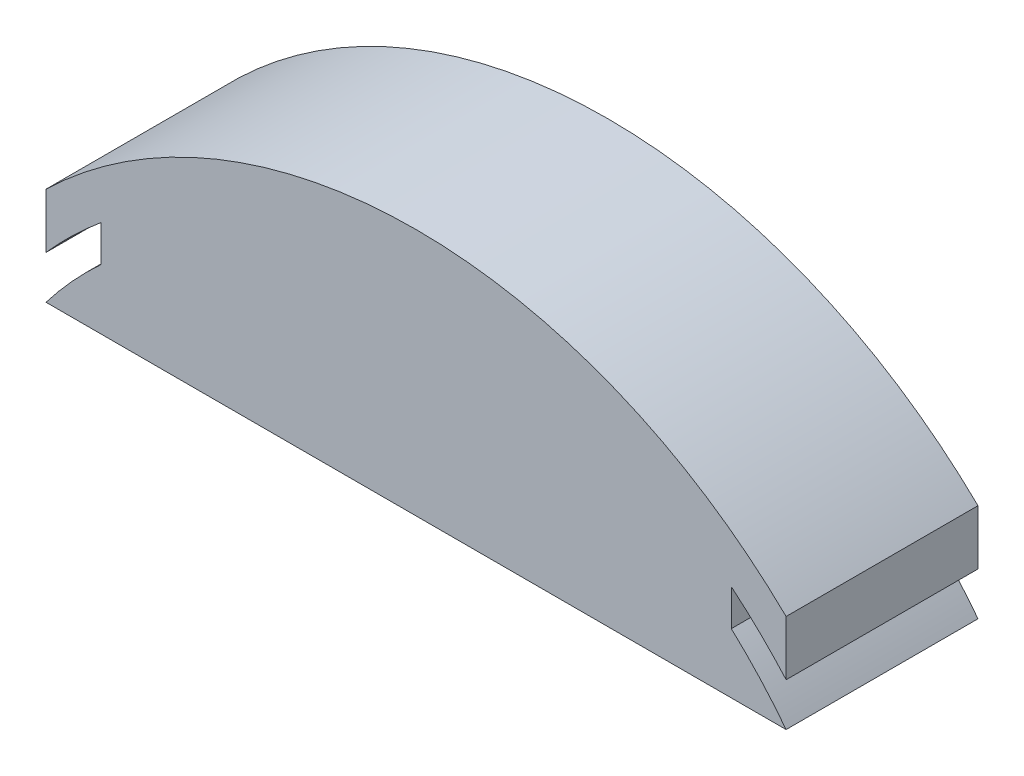
ISO-10303-21;
HEADER;
FILE_DESCRIPTION(('STEP AP214'),'2;1');
FILE_NAME('part.step','',(''),(''),'','','');
FILE_SCHEMA(('AUTOMOTIVE_DESIGN { 1 0 10303 214 1 1 1 1 }'));
ENDSEC;
DATA;
#1=APPLICATION_CONTEXT('core data for automotive mechanical design processes');
#2=APPLICATION_PROTOCOL_DEFINITION('international standard','automotive_design',2000,#1);
#3=PRODUCT_CONTEXT('',#1,'mechanical');
#4=PRODUCT('Part','Part','',(#3));
#5=PRODUCT_RELATED_PRODUCT_CATEGORY('part','',(#4));
#6=PRODUCT_DEFINITION_FORMATION('','',#4);
#7=PRODUCT_DEFINITION_CONTEXT('part definition',#1,'design');
#8=PRODUCT_DEFINITION('design','',#6,#7);
#9=PRODUCT_DEFINITION_SHAPE('','',#8);
#10=(LENGTH_UNIT() NAMED_UNIT(*) SI_UNIT(.MILLI.,.METRE.));
#11=(NAMED_UNIT(*) PLANE_ANGLE_UNIT() SI_UNIT($,.RADIAN.));
#12=(NAMED_UNIT(*) SI_UNIT($,.STERADIAN.) SOLID_ANGLE_UNIT());
#13=UNCERTAINTY_MEASURE_WITH_UNIT(LENGTH_MEASURE(1.E-05),#10,'distance_accuracy_value','');
#14=(GEOMETRIC_REPRESENTATION_CONTEXT(3) GLOBAL_UNCERTAINTY_ASSIGNED_CONTEXT((#13)) GLOBAL_UNIT_ASSIGNED_CONTEXT((#10,
#11,#12)) REPRESENTATION_CONTEXT('',''));
#15=CARTESIAN_POINT('',(0.,0.,0.));
#16=DIRECTION('',(0.,0.,1.));
#17=DIRECTION('',(1.,0.,0.));
#18=AXIS2_PLACEMENT_3D('',#15,#16,#17);
#19=CARTESIAN_POINT('',(0.,1.57389173990474,7.));
#20=DIRECTION('',(-1.,0.,0.));
#21=DIRECTION('',(0.,0.,1.));
#22=AXIS2_PLACEMENT_3D('',#19,#20,#21);
#23=PLANE('',#22);
#24=DIRECTION('',(0.,1.,0.));
#25=VECTOR('',#24,1.);
#26=CARTESIAN_POINT('',(0.,1.57389173990474,0.));
#27=LINE('',#26,#25);
#28=CARTESIAN_POINT('',(0.,1.57389173990474,0.));
#29=VERTEX_POINT('',#28);
#30=CARTESIAN_POINT('',(0.,3.57389173990474,0.));
#31=VERTEX_POINT('',#30);
#32=EDGE_CURVE('E147',#29,#31,#27,.T.);
#33=ORIENTED_EDGE('',*,*,#32,.F.);
#34=DIRECTION('',(0.,0.,-1.));
#35=VECTOR('',#34,1.);
#36=CARTESIAN_POINT('',(0.,1.57389173990474,7.));
#37=LINE('',#36,#35);
#38=CARTESIAN_POINT('',(0.,1.57389173990474,7.));
#39=VERTEX_POINT('',#38);
#40=EDGE_CURVE('E11',#39,#29,#37,.T.);
#41=ORIENTED_EDGE('',*,*,#40,.F.);
#42=DIRECTION('',(0.,1.,0.));
#43=VECTOR('',#42,1.);
#44=CARTESIAN_POINT('',(0.,1.57389173990474,7.));
#45=LINE('',#44,#43);
#46=CARTESIAN_POINT('',(0.,3.57389173990474,7.));
#47=VERTEX_POINT('',#46);
#48=EDGE_CURVE('E170',#39,#47,#45,.T.);
#49=ORIENTED_EDGE('',*,*,#48,.T.);
#50=DIRECTION('',(0.,0.,-1.));
#51=VECTOR('',#50,1.);
#52=CARTESIAN_POINT('',(0.,3.57389173990474,7.));
#53=LINE('',#52,#51);
#54=EDGE_CURVE('E41',#47,#31,#53,.T.);
#55=ORIENTED_EDGE('',*,*,#54,.T.);
#56=EDGE_LOOP('',(#33,#41,#49,#55));
#57=FACE_BOUND('',#56,.T.);
#58=ADVANCED_FACE('F38',(#57),#23,.T.);
#59=CARTESIAN_POINT('',(13.5,-10.3319891598859,7.));
#60=DIRECTION('',(0.,0.,-1.));
#61=DIRECTION('',(-1.,0.,0.));
#62=AXIS2_PLACEMENT_3D('',#59,#60,#61);
#63=CYLINDRICAL_SURFACE('',#62,18.);
#64=CARTESIAN_POINT('',(13.5,-10.3319891598859,0.));
#65=DIRECTION('',(0.,0.,-1.));
#66=DIRECTION('',(-1.,0.,0.));
#67=AXIS2_PLACEMENT_3D('',#64,#65,#66);
#68=CIRCLE('',#67,18.);
#69=CARTESIAN_POINT('',(2.,3.51539326424031,0.));
#70=VERTEX_POINT('',#69);
#71=EDGE_CURVE('E169',#29,#70,#68,.T.);
#72=ORIENTED_EDGE('',*,*,#71,.T.);
#73=DIRECTION('',(0.,0.,-1.));
#74=VECTOR('',#73,1.);
#75=CARTESIAN_POINT('',(2.,3.51539326424031,7.));
#76=LINE('',#75,#74);
#77=CARTESIAN_POINT('',(2.,3.51539326424031,7.));
#78=VERTEX_POINT('',#77);
#79=EDGE_CURVE('E47',#78,#70,#76,.T.);
#80=ORIENTED_EDGE('',*,*,#79,.F.);
#81=CARTESIAN_POINT('',(13.5,-10.3319891598859,7.));
#82=DIRECTION('',(0.,0.,-1.));
#83=DIRECTION('',(-1.,0.,0.));
#84=AXIS2_PLACEMENT_3D('',#81,#82,#83);
#85=CIRCLE('',#84,18.);
#86=EDGE_CURVE('E136',#39,#78,#85,.T.);
#87=ORIENTED_EDGE('',*,*,#86,.F.);
#88=ORIENTED_EDGE('',*,*,#40,.T.);
#89=EDGE_LOOP('',(#72,#80,#87,#88));
#90=FACE_BOUND('',#89,.T.);
#91=ADVANCED_FACE('F189',(#90),#63,.F.);
#92=CARTESIAN_POINT('',(2.,2.187994865663,7.));
#93=DIRECTION('',(-1.,0.,0.));
#94=DIRECTION('',(0.,-1.,0.));
#95=AXIS2_PLACEMENT_3D('',#92,#93,#94);
#96=PLANE('',#95);
#97=DIRECTION('',(0.,1.,0.));
#98=VECTOR('',#97,1.);
#99=CARTESIAN_POINT('',(2.,2.187994865663,0.));
#100=LINE('',#99,#98);
#101=CARTESIAN_POINT('',(2.,2.187994865663,0.));
#102=VERTEX_POINT('',#101);
#103=EDGE_CURVE('E124',#102,#70,#100,.T.);
#104=ORIENTED_EDGE('',*,*,#103,.F.);
#105=DIRECTION('',(0.,0.,-1.));
#106=VECTOR('',#105,1.);
#107=CARTESIAN_POINT('',(2.,2.187994865663,7.));
#108=LINE('',#107,#106);
#109=CARTESIAN_POINT('',(2.,2.187994865663,7.));
#110=VERTEX_POINT('',#109);
#111=EDGE_CURVE('E119',#110,#102,#108,.T.);
#112=ORIENTED_EDGE('',*,*,#111,.F.);
#113=DIRECTION('',(0.,1.,0.));
#114=VECTOR('',#113,1.);
#115=CARTESIAN_POINT('',(2.,2.187994865663,7.));
#116=LINE('',#115,#114);
#117=EDGE_CURVE('E122',#110,#78,#116,.T.);
#118=ORIENTED_EDGE('',*,*,#117,.T.);
#119=ORIENTED_EDGE('',*,*,#79,.T.);
#120=EDGE_LOOP('',(#104,#112,#118,#119));
#121=FACE_BOUND('',#120,.T.);
#122=ADVANCED_FACE('F121',(#121),#96,.T.);
#123=CARTESIAN_POINT('',(13.5,-10.3319891598859,7.));
#124=DIRECTION('',(0.,0.,-1.));
#125=DIRECTION('',(-1.,0.,0.));
#126=AXIS2_PLACEMENT_3D('',#123,#124,#125);
#127=CYLINDRICAL_SURFACE('',#126,17.);
#128=CARTESIAN_POINT('',(13.5,-10.3319891598859,0.));
#129=DIRECTION('',(0.,0.,-1.));
#130=DIRECTION('',(-1.,0.,0.));
#131=AXIS2_PLACEMENT_3D('',#128,#129,#130);
#132=CIRCLE('',#131,17.);
#133=CARTESIAN_POINT('',(0.,0.,0.));
#134=VERTEX_POINT('',#133);
#135=EDGE_CURVE('E166',#134,#102,#132,.T.);
#136=ORIENTED_EDGE('',*,*,#135,.F.);
#137=DIRECTION('',(0.,0.,-1.));
#138=VECTOR('',#137,1.);
#139=CARTESIAN_POINT('',(0.,0.,7.));
#140=LINE('',#139,#138);
#141=CARTESIAN_POINT('',(0.,0.,7.));
#142=VERTEX_POINT('',#141);
#143=EDGE_CURVE('E129',#142,#134,#140,.T.);
#144=ORIENTED_EDGE('',*,*,#143,.F.);
#145=CARTESIAN_POINT('',(13.5,-10.3319891598859,7.));
#146=DIRECTION('',(0.,0.,-1.));
#147=DIRECTION('',(-1.,0.,0.));
#148=AXIS2_PLACEMENT_3D('',#145,#146,#147);
#149=CIRCLE('',#148,17.);
#150=EDGE_CURVE('E135',#142,#110,#149,.T.);
#151=ORIENTED_EDGE('',*,*,#150,.T.);
#152=ORIENTED_EDGE('',*,*,#111,.T.);
#153=EDGE_LOOP('',(#136,#144,#151,#152));
#154=FACE_BOUND('',#153,.T.);
#155=ADVANCED_FACE('F138',(#154),#127,.T.);
#156=CARTESIAN_POINT('',(0.,0.,7.));
#157=DIRECTION('',(0.,1.,0.));
#158=DIRECTION('',(0.,0.,1.));
#159=AXIS2_PLACEMENT_3D('',#156,#157,#158);
#160=PLANE('',#159);
#161=DIRECTION('',(1.,0.,0.));
#162=VECTOR('',#161,1.);
#163=CARTESIAN_POINT('',(0.,0.,0.));
#164=LINE('',#163,#162);
#165=CARTESIAN_POINT('',(27.,0.,0.));
#166=VERTEX_POINT('',#165);
#167=EDGE_CURVE('E163',#134,#166,#164,.T.);
#168=ORIENTED_EDGE('',*,*,#167,.T.);
#169=DIRECTION('',(0.,0.,-1.));
#170=VECTOR('',#169,1.);
#171=CARTESIAN_POINT('',(27.,0.,7.));
#172=LINE('',#171,#170);
#173=CARTESIAN_POINT('',(27.,0.,7.));
#174=VERTEX_POINT('',#173);
#175=EDGE_CURVE('E174',#174,#166,#172,.T.);
#176=ORIENTED_EDGE('',*,*,#175,.F.);
#177=DIRECTION('',(1.,0.,0.));
#178=VECTOR('',#177,1.);
#179=CARTESIAN_POINT('',(0.,0.,7.));
#180=LINE('',#179,#178);
#181=EDGE_CURVE('E140',#142,#174,#180,.T.);
#182=ORIENTED_EDGE('',*,*,#181,.F.);
#183=ORIENTED_EDGE('',*,*,#143,.T.);
#184=EDGE_LOOP('',(#168,#176,#182,#183));
#185=FACE_BOUND('',#184,.T.);
#186=ADVANCED_FACE('F208',(#185),#160,.F.);
#187=CARTESIAN_POINT('',(13.5,-10.3319891598859,7.));
#188=DIRECTION('',(0.,0.,-1.));
#189=DIRECTION('',(-1.,0.,0.));
#190=AXIS2_PLACEMENT_3D('',#187,#188,#189);
#191=CYLINDRICAL_SURFACE('',#190,17.);
#192=CARTESIAN_POINT('',(13.5,-10.3319891598859,0.));
#193=DIRECTION('',(0.,0.,-1.));
#194=DIRECTION('',(-1.,0.,0.));
#195=AXIS2_PLACEMENT_3D('',#192,#193,#194);
#196=CIRCLE('',#195,17.);
#197=CARTESIAN_POINT('',(25.,2.187994865663,0.));
#198=VERTEX_POINT('',#197);
#199=EDGE_CURVE('E160',#198,#166,#196,.T.);
#200=ORIENTED_EDGE('',*,*,#199,.F.);
#201=DIRECTION('',(0.,0.,-1.));
#202=VECTOR('',#201,1.);
#203=CARTESIAN_POINT('',(25.,2.187994865663,7.));
#204=LINE('',#203,#202);
#205=CARTESIAN_POINT('',(25.,2.187994865663,7.));
#206=VERTEX_POINT('',#205);
#207=EDGE_CURVE('E176',#206,#198,#204,.T.);
#208=ORIENTED_EDGE('',*,*,#207,.F.);
#209=CARTESIAN_POINT('',(13.5,-10.3319891598859,7.));
#210=DIRECTION('',(0.,0.,-1.));
#211=DIRECTION('',(-1.,0.,0.));
#212=AXIS2_PLACEMENT_3D('',#209,#210,#211);
#213=CIRCLE('',#212,17.);
#214=EDGE_CURVE('E142',#206,#174,#213,.T.);
#215=ORIENTED_EDGE('',*,*,#214,.T.);
#216=ORIENTED_EDGE('',*,*,#175,.T.);
#217=EDGE_LOOP('',(#200,#208,#215,#216));
#218=FACE_BOUND('',#217,.T.);
#219=ADVANCED_FACE('F203',(#218),#191,.T.);
#220=CARTESIAN_POINT('',(25.,2.187994865663,7.));
#221=DIRECTION('',(-1.,0.,0.));
#222=DIRECTION('',(0.,0.,1.));
#223=AXIS2_PLACEMENT_3D('',#220,#221,#222);
#224=PLANE('',#223);
#225=DIRECTION('',(0.,1.,0.));
#226=VECTOR('',#225,1.);
#227=CARTESIAN_POINT('',(25.,2.187994865663,0.));
#228=LINE('',#227,#226);
#229=CARTESIAN_POINT('',(25.,3.51539326424031,0.));
#230=VERTEX_POINT('',#229);
#231=EDGE_CURVE('E158',#198,#230,#228,.T.);
#232=ORIENTED_EDGE('',*,*,#231,.T.);
#233=DIRECTION('',(0.,0.,-1.));
#234=VECTOR('',#233,1.);
#235=CARTESIAN_POINT('',(25.,3.51539326424031,7.));
#236=LINE('',#235,#234);
#237=CARTESIAN_POINT('',(25.,3.51539326424031,7.));
#238=VERTEX_POINT('',#237);
#239=EDGE_CURVE('E178',#238,#230,#236,.T.);
#240=ORIENTED_EDGE('',*,*,#239,.F.);
#241=DIRECTION('',(0.,1.,0.));
#242=VECTOR('',#241,1.);
#243=CARTESIAN_POINT('',(25.,2.187994865663,7.));
#244=LINE('',#243,#242);
#245=EDGE_CURVE('E198',#206,#238,#244,.T.);
#246=ORIENTED_EDGE('',*,*,#245,.F.);
#247=ORIENTED_EDGE('',*,*,#207,.T.);
#248=EDGE_LOOP('',(#232,#240,#246,#247));
#249=FACE_BOUND('',#248,.T.);
#250=ADVANCED_FACE('F213',(#249),#224,.F.);
#251=CARTESIAN_POINT('',(13.5,-10.3319891598859,7.));
#252=DIRECTION('',(0.,0.,-1.));
#253=DIRECTION('',(-1.,0.,0.));
#254=AXIS2_PLACEMENT_3D('',#251,#252,#253);
#255=CYLINDRICAL_SURFACE('',#254,18.);
#256=CARTESIAN_POINT('',(13.5,-10.3319891598859,0.));
#257=DIRECTION('',(0.,0.,-1.));
#258=DIRECTION('',(-1.,0.,0.));
#259=AXIS2_PLACEMENT_3D('',#256,#257,#258);
#260=CIRCLE('',#259,18.);
#261=CARTESIAN_POINT('',(27.,1.57389173990474,0.));
#262=VERTEX_POINT('',#261);
#263=EDGE_CURVE('E156',#230,#262,#260,.T.);
#264=ORIENTED_EDGE('',*,*,#263,.T.);
#265=DIRECTION('',(0.,0.,-1.));
#266=VECTOR('',#265,1.);
#267=CARTESIAN_POINT('',(27.,1.57389173990474,7.));
#268=LINE('',#267,#266);
#269=CARTESIAN_POINT('',(27.,1.57389173990474,7.));
#270=VERTEX_POINT('',#269);
#271=EDGE_CURVE('E181',#270,#262,#268,.T.);
#272=ORIENTED_EDGE('',*,*,#271,.F.);
#273=CARTESIAN_POINT('',(13.5,-10.3319891598859,7.));
#274=DIRECTION('',(0.,0.,-1.));
#275=DIRECTION('',(-1.,0.,0.));
#276=AXIS2_PLACEMENT_3D('',#273,#274,#275);
#277=CIRCLE('',#276,18.);
#278=EDGE_CURVE('E196',#238,#270,#277,.T.);
#279=ORIENTED_EDGE('',*,*,#278,.F.);
#280=ORIENTED_EDGE('',*,*,#239,.T.);
#281=EDGE_LOOP('',(#264,#272,#279,#280));
#282=FACE_BOUND('',#281,.T.);
#283=ADVANCED_FACE('F216',(#282),#255,.F.);
#284=CARTESIAN_POINT('',(27.,1.57389173990474,7.));
#285=DIRECTION('',(-1.,0.,0.));
#286=DIRECTION('',(0.,0.,1.));
#287=AXIS2_PLACEMENT_3D('',#284,#285,#286);
#288=PLANE('',#287);
#289=DIRECTION('',(0.,1.,0.));
#290=VECTOR('',#289,1.);
#291=CARTESIAN_POINT('',(27.,1.57389173990474,0.));
#292=LINE('',#291,#290);
#293=CARTESIAN_POINT('',(27.,3.57389173990474,0.));
#294=VERTEX_POINT('',#293);
#295=EDGE_CURVE('E153',#262,#294,#292,.T.);
#296=ORIENTED_EDGE('',*,*,#295,.T.);
#297=DIRECTION('',(0.,0.,-1.));
#298=VECTOR('',#297,1.);
#299=CARTESIAN_POINT('',(27.,3.57389173990474,7.));
#300=LINE('',#299,#298);
#301=CARTESIAN_POINT('',(27.,3.57389173990474,7.));
#302=VERTEX_POINT('',#301);
#303=EDGE_CURVE('E183',#302,#294,#300,.T.);
#304=ORIENTED_EDGE('',*,*,#303,.F.);
#305=DIRECTION('',(0.,1.,0.));
#306=VECTOR('',#305,1.);
#307=CARTESIAN_POINT('',(27.,1.57389173990474,7.));
#308=LINE('',#307,#306);
#309=EDGE_CURVE('E192',#270,#302,#308,.T.);
#310=ORIENTED_EDGE('',*,*,#309,.F.);
#311=ORIENTED_EDGE('',*,*,#271,.T.);
#312=EDGE_LOOP('',(#296,#304,#310,#311));
#313=FACE_BOUND('',#312,.T.);
#314=ADVANCED_FACE('F220',(#313),#288,.F.);
#315=CARTESIAN_POINT('',(13.5,-10.3319891598859,7.));
#316=DIRECTION('',(0.,0.,-1.));
#317=DIRECTION('',(-1.,0.,0.));
#318=AXIS2_PLACEMENT_3D('',#315,#316,#317);
#319=CYLINDRICAL_SURFACE('',#318,19.3810093544986);
#320=CARTESIAN_POINT('',(13.5,-10.3319891598859,0.));
#321=DIRECTION('',(0.,0.,-1.));
#322=DIRECTION('',(-1.,0.,0.));
#323=AXIS2_PLACEMENT_3D('',#320,#321,#322);
#324=CIRCLE('',#323,19.3810093544986);
#325=EDGE_CURVE('E150',#31,#294,#324,.T.);
#326=ORIENTED_EDGE('',*,*,#325,.F.);
#327=ORIENTED_EDGE('',*,*,#54,.F.);
#328=CARTESIAN_POINT('',(13.5,-10.3319891598859,7.));
#329=DIRECTION('',(0.,0.,-1.));
#330=DIRECTION('',(-1.,0.,0.));
#331=AXIS2_PLACEMENT_3D('',#328,#329,#330);
#332=CIRCLE('',#331,19.3810093544986);
#333=EDGE_CURVE('E190',#47,#302,#332,.T.);
#334=ORIENTED_EDGE('',*,*,#333,.T.);
#335=ORIENTED_EDGE('',*,*,#303,.T.);
#336=EDGE_LOOP('',(#326,#327,#334,#335));
#337=FACE_BOUND('',#336,.T.);
#338=ADVANCED_FACE('F185',(#337),#319,.T.);
#339=CARTESIAN_POINT('',(13.5,-10.3319891598859,7.));
#340=DIRECTION('',(0.,0.,-1.));
#341=DIRECTION('',(-1.,0.,0.));
#342=AXIS2_PLACEMENT_3D('',#339,#340,#341);
#343=PLANE('',#342);
#344=ORIENTED_EDGE('',*,*,#48,.F.);
#345=ORIENTED_EDGE('',*,*,#86,.T.);
#346=ORIENTED_EDGE('',*,*,#117,.F.);
#347=ORIENTED_EDGE('',*,*,#150,.F.);
#348=ORIENTED_EDGE('',*,*,#181,.T.);
#349=ORIENTED_EDGE('',*,*,#214,.F.);
#350=ORIENTED_EDGE('',*,*,#245,.T.);
#351=ORIENTED_EDGE('',*,*,#278,.T.);
#352=ORIENTED_EDGE('',*,*,#309,.T.);
#353=ORIENTED_EDGE('',*,*,#333,.F.);
#354=EDGE_LOOP('',(#344,#345,#346,#347,#348,#349,#350,#351,#352,#353));
#355=FACE_BOUND('',#354,.T.);
#356=ADVANCED_FACE('F134',(#355),#343,.F.);
#357=CARTESIAN_POINT('',(13.5,-10.3319891598859,0.));
#358=DIRECTION('',(0.,0.,-1.));
#359=DIRECTION('',(-1.,0.,0.));
#360=AXIS2_PLACEMENT_3D('',#357,#358,#359);
#361=PLANE('',#360);
#362=ORIENTED_EDGE('',*,*,#32,.T.);
#363=ORIENTED_EDGE('',*,*,#325,.T.);
#364=ORIENTED_EDGE('',*,*,#295,.F.);
#365=ORIENTED_EDGE('',*,*,#263,.F.);
#366=ORIENTED_EDGE('',*,*,#231,.F.);
#367=ORIENTED_EDGE('',*,*,#199,.T.);
#368=ORIENTED_EDGE('',*,*,#167,.F.);
#369=ORIENTED_EDGE('',*,*,#135,.T.);
#370=ORIENTED_EDGE('',*,*,#103,.T.);
#371=ORIENTED_EDGE('',*,*,#71,.F.);
#372=EDGE_LOOP('',(#362,#363,#364,#365,#366,#367,#368,#369,#370,#371));
#373=FACE_BOUND('',#372,.T.);
#374=ADVANCED_FACE('F188',(#373),#361,.T.);
#375=CLOSED_SHELL('',(#58,#91,#122,#155,#186,#219,#250,#283,#314,#338,#356,#374));
#376=MANIFOLD_SOLID_BREP('B2',#375);
#377=ADVANCED_BREP_SHAPE_REPRESENTATION('',(#18,#376),#14);
#378=SHAPE_DEFINITION_REPRESENTATION(#9,#377);
ENDSEC;
END-ISO-10303-21;
